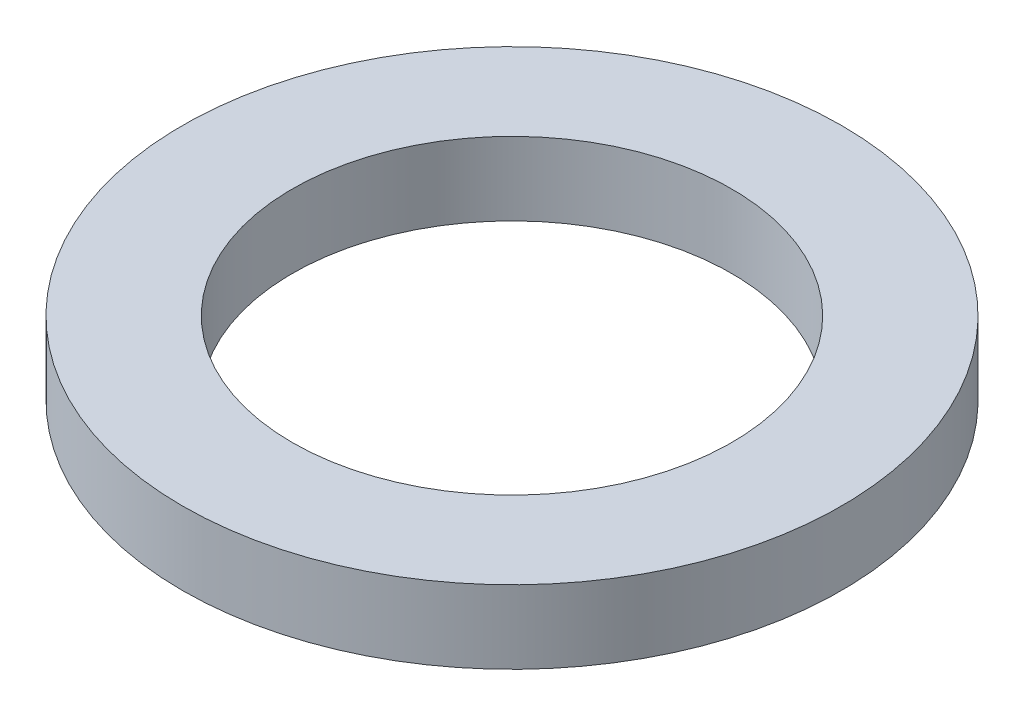
ISO-10303-21;
HEADER;
FILE_DESCRIPTION(('STEP AP214'),'2;1');
FILE_NAME('part.step','',(''),(''),'','','');
FILE_SCHEMA(('AUTOMOTIVE_DESIGN { 1 0 10303 214 1 1 1 1 }'));
ENDSEC;
DATA;
#1=APPLICATION_CONTEXT('core data for automotive mechanical design processes');
#2=APPLICATION_PROTOCOL_DEFINITION('international standard','automotive_design',2000,#1);
#3=PRODUCT_CONTEXT('',#1,'mechanical');
#4=PRODUCT('Part','Part','',(#3));
#5=PRODUCT_RELATED_PRODUCT_CATEGORY('part','',(#4));
#6=PRODUCT_DEFINITION_FORMATION('','',#4);
#7=PRODUCT_DEFINITION_CONTEXT('part definition',#1,'design');
#8=PRODUCT_DEFINITION('design','',#6,#7);
#9=PRODUCT_DEFINITION_SHAPE('','',#8);
#10=(LENGTH_UNIT() NAMED_UNIT(*) SI_UNIT(.MILLI.,.METRE.));
#11=(NAMED_UNIT(*) PLANE_ANGLE_UNIT() SI_UNIT($,.RADIAN.));
#12=(NAMED_UNIT(*) SI_UNIT($,.STERADIAN.) SOLID_ANGLE_UNIT());
#13=UNCERTAINTY_MEASURE_WITH_UNIT(LENGTH_MEASURE(1.E-05),#10,'distance_accuracy_value','');
#14=(GEOMETRIC_REPRESENTATION_CONTEXT(3) GLOBAL_UNCERTAINTY_ASSIGNED_CONTEXT((#13)) GLOBAL_UNIT_ASSIGNED_CONTEXT((#10,
#11,#12)) REPRESENTATION_CONTEXT('',''));
#15=CARTESIAN_POINT('',(0.,0.,0.));
#16=DIRECTION('',(0.,0.,1.));
#17=DIRECTION('',(1.,0.,0.));
#18=AXIS2_PLACEMENT_3D('',#15,#16,#17);
#19=CARTESIAN_POINT('',(0.,0.5,0.));
#20=DIRECTION('',(0.,1.,0.));
#21=DIRECTION('',(0.,0.,1.));
#22=AXIS2_PLACEMENT_3D('',#19,#20,#21);
#23=PLANE('',#22);
#24=CARTESIAN_POINT('',(0.,0.5,0.));
#25=DIRECTION('',(0.,1.,0.));
#26=DIRECTION('',(0.,0.,1.));
#27=AXIS2_PLACEMENT_3D('',#24,#25,#26);
#28=CIRCLE('',#27,2.25);
#29=CARTESIAN_POINT('',(0.,0.5,2.25));
#30=VERTEX_POINT('',#29);
#31=EDGE_CURVE('E10',#30,#30,#28,.T.);
#32=ORIENTED_EDGE('',*,*,#31,.T.);
#33=EDGE_LOOP('',(#32));
#34=FACE_BOUND('',#33,.T.);
#35=CARTESIAN_POINT('',(0.,0.5,0.));
#36=DIRECTION('',(0.,1.,0.));
#37=DIRECTION('',(0.,0.,1.));
#38=AXIS2_PLACEMENT_3D('',#35,#36,#37);
#39=CIRCLE('',#38,1.5);
#40=CARTESIAN_POINT('',(0.,0.5,1.5));
#41=VERTEX_POINT('',#40);
#42=EDGE_CURVE('E54',#41,#41,#39,.T.);
#43=ORIENTED_EDGE('',*,*,#42,.F.);
#44=EDGE_LOOP('',(#43));
#45=FACE_BOUND('',#44,.T.);
#46=ADVANCED_FACE('F41',(#34,#45),#23,.T.);
#47=CARTESIAN_POINT('',(0.,0.,0.));
#48=DIRECTION('',(0.,1.,0.));
#49=DIRECTION('',(0.,0.,1.));
#50=AXIS2_PLACEMENT_3D('',#47,#48,#49);
#51=PLANE('',#50);
#52=CARTESIAN_POINT('',(0.,0.,0.));
#53=DIRECTION('',(0.,1.,0.));
#54=DIRECTION('',(0.,0.,1.));
#55=AXIS2_PLACEMENT_3D('',#52,#53,#54);
#56=CIRCLE('',#55,2.25);
#57=CARTESIAN_POINT('',(0.,0.,2.25));
#58=VERTEX_POINT('',#57);
#59=EDGE_CURVE('E45',#58,#58,#56,.T.);
#60=ORIENTED_EDGE('',*,*,#59,.F.);
#61=EDGE_LOOP('',(#60));
#62=FACE_BOUND('',#61,.T.);
#63=CARTESIAN_POINT('',(0.,0.,0.));
#64=DIRECTION('',(0.,1.,0.));
#65=DIRECTION('',(0.,0.,1.));
#66=AXIS2_PLACEMENT_3D('',#63,#64,#65);
#67=CIRCLE('',#66,1.5);
#68=CARTESIAN_POINT('',(0.,0.,1.5));
#69=VERTEX_POINT('',#68);
#70=EDGE_CURVE('E56',#69,#69,#67,.T.);
#71=ORIENTED_EDGE('',*,*,#70,.T.);
#72=EDGE_LOOP('',(#71));
#73=FACE_BOUND('',#72,.T.);
#74=ADVANCED_FACE('F68',(#62,#73),#51,.F.);
#75=CARTESIAN_POINT('',(0.,0.5,0.));
#76=DIRECTION('',(0.,-1.,0.));
#77=DIRECTION('',(0.,0.,-1.));
#78=AXIS2_PLACEMENT_3D('',#75,#76,#77);
#79=CYLINDRICAL_SURFACE('',#78,2.25);
#80=ORIENTED_EDGE('',*,*,#31,.F.);
#81=EDGE_LOOP('',(#80));
#82=FACE_BOUND('',#81,.T.);
#83=ORIENTED_EDGE('',*,*,#59,.T.);
#84=EDGE_LOOP('',(#83));
#85=FACE_BOUND('',#84,.T.);
#86=ADVANCED_FACE('F43',(#82,#85),#79,.T.);
#87=CARTESIAN_POINT('',(0.,0.5,0.));
#88=DIRECTION('',(0.,-1.,0.));
#89=DIRECTION('',(0.,0.,-1.));
#90=AXIS2_PLACEMENT_3D('',#87,#88,#89);
#91=CYLINDRICAL_SURFACE('',#90,1.5);
#92=ORIENTED_EDGE('',*,*,#42,.T.);
#93=EDGE_LOOP('',(#92));
#94=FACE_BOUND('',#93,.T.);
#95=ORIENTED_EDGE('',*,*,#70,.F.);
#96=EDGE_LOOP('',(#95));
#97=FACE_BOUND('',#96,.T.);
#98=ADVANCED_FACE('F64',(#94,#97),#91,.F.);
#99=CLOSED_SHELL('',(#46,#74,#86,#98));
#100=MANIFOLD_SOLID_BREP('B2',#99);
#101=ADVANCED_BREP_SHAPE_REPRESENTATION('',(#18,#100),#14);
#102=SHAPE_DEFINITION_REPRESENTATION(#9,#101);
ENDSEC;
END-ISO-10303-21;
